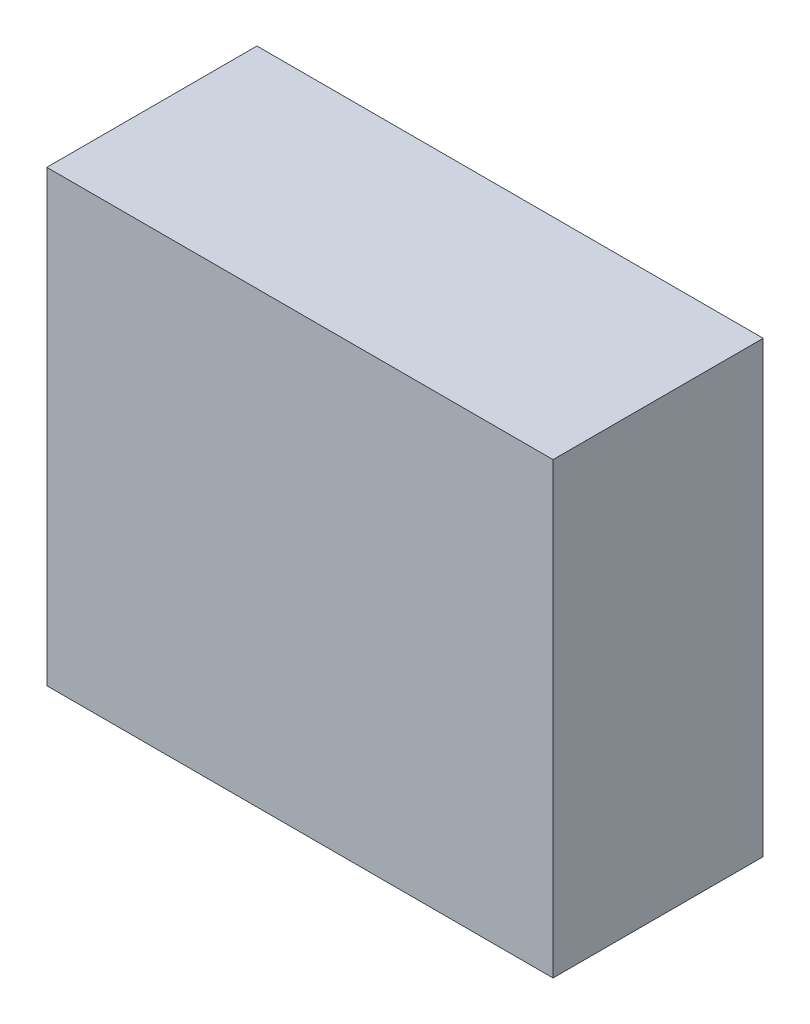
ISO-10303-21;
HEADER;
FILE_DESCRIPTION(('STEP AP214'),'2;1');
FILE_NAME('part.step','',(''),(''),'','','');
FILE_SCHEMA(('AUTOMOTIVE_DESIGN { 1 0 10303 214 1 1 1 1 }'));
ENDSEC;
DATA;
#1=APPLICATION_CONTEXT('core data for automotive mechanical design processes');
#2=APPLICATION_PROTOCOL_DEFINITION('international standard','automotive_design',2000,#1);
#3=PRODUCT_CONTEXT('',#1,'mechanical');
#4=PRODUCT('Part','Part','',(#3));
#5=PRODUCT_RELATED_PRODUCT_CATEGORY('part','',(#4));
#6=PRODUCT_DEFINITION_FORMATION('','',#4);
#7=PRODUCT_DEFINITION_CONTEXT('part definition',#1,'design');
#8=PRODUCT_DEFINITION('design','',#6,#7);
#9=PRODUCT_DEFINITION_SHAPE('','',#8);
#10=(LENGTH_UNIT() NAMED_UNIT(*) SI_UNIT(.MILLI.,.METRE.));
#11=(NAMED_UNIT(*) PLANE_ANGLE_UNIT() SI_UNIT($,.RADIAN.));
#12=(NAMED_UNIT(*) SI_UNIT($,.STERADIAN.) SOLID_ANGLE_UNIT());
#13=UNCERTAINTY_MEASURE_WITH_UNIT(LENGTH_MEASURE(1.E-05),#10,'distance_accuracy_value','');
#14=(GEOMETRIC_REPRESENTATION_CONTEXT(3) GLOBAL_UNCERTAINTY_ASSIGNED_CONTEXT((#13)) GLOBAL_UNIT_ASSIGNED_CONTEXT((#10,
#11,#12)) REPRESENTATION_CONTEXT('',''));
#15=CARTESIAN_POINT('',(0.,0.,0.));
#16=DIRECTION('',(0.,0.,1.));
#17=DIRECTION('',(1.,0.,0.));
#18=AXIS2_PLACEMENT_3D('',#15,#16,#17);
#19=CARTESIAN_POINT('',(-0.32500316,1.17500146,0.));
#20=DIRECTION('',(0.,1.,0.));
#21=DIRECTION('',(1.,0.,0.));
#22=AXIS2_PLACEMENT_3D('',#19,#20,#21);
#23=PLANE('',#22);
#24=DIRECTION('',(0.,0.,1.));
#25=VECTOR('',#24,1.);
#26=CARTESIAN_POINT('',(-0.32500316,1.17500146,0.));
#27=LINE('',#26,#25);
#28=CARTESIAN_POINT('',(-0.32500316,1.17500146,0.));
#29=VERTEX_POINT('',#28);
#30=CARTESIAN_POINT('',(-0.32500316,1.17500146,1.10000034));
#31=VERTEX_POINT('',#30);
#32=EDGE_CURVE('E11',#29,#31,#27,.T.);
#33=ORIENTED_EDGE('',*,*,#32,.T.);
#34=DIRECTION('',(1.,0.,0.));
#35=VECTOR('',#34,1.);
#36=CARTESIAN_POINT('',(-0.32500316,1.17500146,1.10000034));
#37=LINE('',#36,#35);
#38=CARTESIAN_POINT('',(2.32499916,1.17500146,1.10000034));
#39=VERTEX_POINT('',#38);
#40=EDGE_CURVE('E23',#31,#39,#37,.T.);
#41=ORIENTED_EDGE('',*,*,#40,.T.);
#42=DIRECTION('',(0.,0.,1.));
#43=VECTOR('',#42,1.);
#44=CARTESIAN_POINT('',(2.32499916,1.17500146,0.));
#45=LINE('',#44,#43);
#46=CARTESIAN_POINT('',(2.32499916,1.17500146,0.));
#47=VERTEX_POINT('',#46);
#48=EDGE_CURVE('E83',#47,#39,#45,.T.);
#49=ORIENTED_EDGE('',*,*,#48,.F.);
#50=DIRECTION('',(1.,0.,0.));
#51=VECTOR('',#50,1.);
#52=CARTESIAN_POINT('',(-0.32500316,1.17500146,0.));
#53=LINE('',#52,#51);
#54=EDGE_CURVE('E81',#29,#47,#53,.T.);
#55=ORIENTED_EDGE('',*,*,#54,.F.);
#56=EDGE_LOOP('',(#33,#41,#49,#55));
#57=FACE_BOUND('',#56,.T.);
#58=ADVANCED_FACE('F16',(#57),#23,.T.);
#59=CARTESIAN_POINT('',(2.32499916,1.17500146,0.));
#60=DIRECTION('',(1.,0.,0.));
#61=DIRECTION('',(0.,-1.,0.));
#62=AXIS2_PLACEMENT_3D('',#59,#60,#61);
#63=PLANE('',#62);
#64=ORIENTED_EDGE('',*,*,#48,.T.);
#65=DIRECTION('',(0.,-1.,0.));
#66=VECTOR('',#65,1.);
#67=CARTESIAN_POINT('',(2.32499916,1.17500146,1.10000034));
#68=LINE('',#67,#66);
#69=CARTESIAN_POINT('',(2.32499916,-1.17499892,1.10000034));
#70=VERTEX_POINT('',#69);
#71=EDGE_CURVE('E79',#39,#70,#68,.T.);
#72=ORIENTED_EDGE('',*,*,#71,.T.);
#73=DIRECTION('',(0.,0.,1.));
#74=VECTOR('',#73,1.);
#75=CARTESIAN_POINT('',(2.32499916,-1.17499892,0.));
#76=LINE('',#75,#74);
#77=CARTESIAN_POINT('',(2.32499916,-1.17499892,0.));
#78=VERTEX_POINT('',#77);
#79=EDGE_CURVE('E77',#78,#70,#76,.T.);
#80=ORIENTED_EDGE('',*,*,#79,.F.);
#81=DIRECTION('',(0.,-1.,0.));
#82=VECTOR('',#81,1.);
#83=CARTESIAN_POINT('',(2.32499916,1.17500146,0.));
#84=LINE('',#83,#82);
#85=EDGE_CURVE('E67',#47,#78,#84,.T.);
#86=ORIENTED_EDGE('',*,*,#85,.F.);
#87=EDGE_LOOP('',(#64,#72,#80,#86));
#88=FACE_BOUND('',#87,.T.);
#89=ADVANCED_FACE('F90',(#88),#63,.T.);
#90=CARTESIAN_POINT('',(2.32499916,-1.17499892,0.));
#91=DIRECTION('',(0.,-1.,0.));
#92=DIRECTION('',(-1.,0.,0.));
#93=AXIS2_PLACEMENT_3D('',#90,#91,#92);
#94=PLANE('',#93);
#95=ORIENTED_EDGE('',*,*,#79,.T.);
#96=DIRECTION('',(-1.,0.,0.));
#97=VECTOR('',#96,1.);
#98=CARTESIAN_POINT('',(2.32499916,-1.17499892,1.10000034));
#99=LINE('',#98,#97);
#100=CARTESIAN_POINT('',(-0.32500316,-1.17499892,1.10000034));
#101=VERTEX_POINT('',#100);
#102=EDGE_CURVE('E59',#70,#101,#99,.T.);
#103=ORIENTED_EDGE('',*,*,#102,.T.);
#104=DIRECTION('',(0.,0.,1.));
#105=VECTOR('',#104,1.);
#106=CARTESIAN_POINT('',(-0.32500316,-1.17499892,0.));
#107=LINE('',#106,#105);
#108=CARTESIAN_POINT('',(-0.32500316,-1.17499892,0.));
#109=VERTEX_POINT('',#108);
#110=EDGE_CURVE('E53',#109,#101,#107,.T.);
#111=ORIENTED_EDGE('',*,*,#110,.F.);
#112=DIRECTION('',(-1.,0.,0.));
#113=VECTOR('',#112,1.);
#114=CARTESIAN_POINT('',(2.32499916,-1.17499892,0.));
#115=LINE('',#114,#113);
#116=EDGE_CURVE('E57',#78,#109,#115,.T.);
#117=ORIENTED_EDGE('',*,*,#116,.F.);
#118=EDGE_LOOP('',(#95,#103,#111,#117));
#119=FACE_BOUND('',#118,.T.);
#120=ADVANCED_FACE('F56',(#119),#94,.T.);
#121=CARTESIAN_POINT('',(-0.32500316,-1.17499892,0.));
#122=DIRECTION('',(-1.,0.,0.));
#123=DIRECTION('',(0.,1.,0.));
#124=AXIS2_PLACEMENT_3D('',#121,#122,#123);
#125=PLANE('',#124);
#126=ORIENTED_EDGE('',*,*,#110,.T.);
#127=DIRECTION('',(0.,1.,0.));
#128=VECTOR('',#127,1.);
#129=CARTESIAN_POINT('',(-0.32500316,-1.17499892,1.10000034));
#130=LINE('',#129,#128);
#131=EDGE_CURVE('E69',#101,#31,#130,.T.);
#132=ORIENTED_EDGE('',*,*,#131,.T.);
#133=ORIENTED_EDGE('',*,*,#32,.F.);
#134=DIRECTION('',(0.,1.,0.));
#135=VECTOR('',#134,1.);
#136=CARTESIAN_POINT('',(-0.32500316,-1.17499892,0.));
#137=LINE('',#136,#135);
#138=EDGE_CURVE('E65',#109,#29,#137,.T.);
#139=ORIENTED_EDGE('',*,*,#138,.F.);
#140=EDGE_LOOP('',(#126,#132,#133,#139));
#141=FACE_BOUND('',#140,.T.);
#142=ADVANCED_FACE('F71',(#141),#125,.T.);
#143=CARTESIAN_POINT('',(-0.32500316,1.17500146,0.));
#144=DIRECTION('',(0.,0.,1.));
#145=DIRECTION('',(1.,0.,0.));
#146=AXIS2_PLACEMENT_3D('',#143,#144,#145);
#147=PLANE('',#146);
#148=ORIENTED_EDGE('',*,*,#54,.T.);
#149=ORIENTED_EDGE('',*,*,#85,.T.);
#150=ORIENTED_EDGE('',*,*,#116,.T.);
#151=ORIENTED_EDGE('',*,*,#138,.T.);
#152=EDGE_LOOP('',(#148,#149,#150,#151));
#153=FACE_BOUND('',#152,.T.);
#154=ADVANCED_FACE('F64',(#153),#147,.F.);
#155=CARTESIAN_POINT('',(-0.32500316,1.17500146,1.10000034));
#156=DIRECTION('',(0.,0.,1.));
#157=DIRECTION('',(1.,0.,0.));
#158=AXIS2_PLACEMENT_3D('',#155,#156,#157);
#159=PLANE('',#158);
#160=ORIENTED_EDGE('',*,*,#131,.F.);
#161=ORIENTED_EDGE('',*,*,#102,.F.);
#162=ORIENTED_EDGE('',*,*,#71,.F.);
#163=ORIENTED_EDGE('',*,*,#40,.F.);
#164=EDGE_LOOP('',(#160,#161,#162,#163));
#165=FACE_BOUND('',#164,.T.);
#166=ADVANCED_FACE('F88',(#165),#159,.T.);
#167=CLOSED_SHELL('',(#58,#89,#120,#142,#154,#166));
#168=MANIFOLD_SOLID_BREP('B1',#167);
#169=ADVANCED_BREP_SHAPE_REPRESENTATION('',(#18,#168),#14);
#170=SHAPE_DEFINITION_REPRESENTATION(#9,#169);
ENDSEC;
END-ISO-10303-21;
